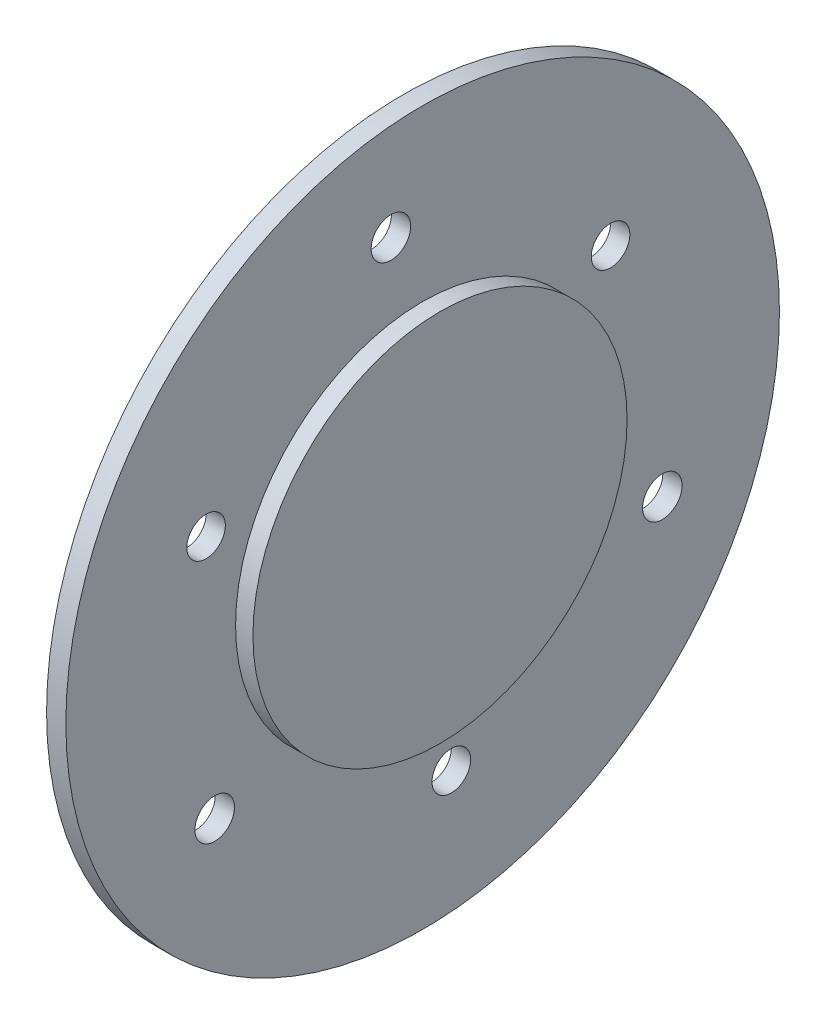
ISO-10303-21;
HEADER;
FILE_DESCRIPTION(('STEP AP214'),'2;1');
FILE_NAME('part.step','',(''),(''),'','','');
FILE_SCHEMA(('AUTOMOTIVE_DESIGN { 1 0 10303 214 1 1 1 1 }'));
ENDSEC;
DATA;
#1=APPLICATION_CONTEXT('core data for automotive mechanical design processes');
#2=APPLICATION_PROTOCOL_DEFINITION('international standard','automotive_design',2000,#1);
#3=PRODUCT_CONTEXT('',#1,'mechanical');
#4=PRODUCT('Part','Part','',(#3));
#5=PRODUCT_RELATED_PRODUCT_CATEGORY('part','',(#4));
#6=PRODUCT_DEFINITION_FORMATION('','',#4);
#7=PRODUCT_DEFINITION_CONTEXT('part definition',#1,'design');
#8=PRODUCT_DEFINITION('design','',#6,#7);
#9=PRODUCT_DEFINITION_SHAPE('','',#8);
#10=(LENGTH_UNIT() NAMED_UNIT(*) SI_UNIT(.MILLI.,.METRE.));
#11=(NAMED_UNIT(*) PLANE_ANGLE_UNIT() SI_UNIT($,.RADIAN.));
#12=(NAMED_UNIT(*) SI_UNIT($,.STERADIAN.) SOLID_ANGLE_UNIT());
#13=UNCERTAINTY_MEASURE_WITH_UNIT(LENGTH_MEASURE(1.E-05),#10,'distance_accuracy_value','');
#14=(GEOMETRIC_REPRESENTATION_CONTEXT(3) GLOBAL_UNCERTAINTY_ASSIGNED_CONTEXT((#13)) GLOBAL_UNIT_ASSIGNED_CONTEXT((#10,
#11,#12)) REPRESENTATION_CONTEXT('',''));
#15=CARTESIAN_POINT('',(0.,0.,0.));
#16=DIRECTION('',(0.,0.,1.));
#17=DIRECTION('',(1.,0.,0.));
#18=AXIS2_PLACEMENT_3D('',#15,#16,#17);
#19=CARTESIAN_POINT('',(6.4,0.,0.));
#20=DIRECTION('',(1.,0.,0.));
#21=DIRECTION('',(0.,0.,1.));
#22=AXIS2_PLACEMENT_3D('',#19,#20,#21);
#23=PLANE('',#22);
#24=CARTESIAN_POINT('',(6.4,0.,0.));
#25=DIRECTION('',(-1.,0.,0.));
#26=DIRECTION('',(0.,0.,-1.));
#27=AXIS2_PLACEMENT_3D('',#24,#25,#26);
#28=CIRCLE('',#27,9.7);
#29=CARTESIAN_POINT('',(6.4,0.,-9.7));
#30=VERTEX_POINT('',#29);
#31=EDGE_CURVE('E39',#30,#30,#28,.T.);
#32=ORIENTED_EDGE('',*,*,#31,.F.);
#33=EDGE_LOOP('',(#32));
#34=FACE_BOUND('',#33,.T.);
#35=ADVANCED_FACE('F14',(#34),#23,.T.);
#36=CARTESIAN_POINT('',(4.4,-12.10906305002,-1.486805989543));
#37=DIRECTION('',(1.,0.,0.));
#38=DIRECTION('',(0.,0.,-1.));
#39=AXIS2_PLACEMENT_3D('',#36,#37,#38);
#40=CYLINDRICAL_SURFACE('',#39,1.);
#41=CARTESIAN_POINT('',(5.5,-12.10906305002,-1.486805989543));
#42=DIRECTION('',(-1.,0.,0.));
#43=DIRECTION('',(0.,0.,-1.));
#44=AXIS2_PLACEMENT_3D('',#41,#42,#43);
#45=CIRCLE('',#44,1.);
#46=CARTESIAN_POINT('',(5.5,-12.10906305002,-2.486805989543));
#47=VERTEX_POINT('',#46);
#48=EDGE_CURVE('E138',#47,#47,#45,.T.);
#49=ORIENTED_EDGE('',*,*,#48,.F.);
#50=DIRECTION('',(1.,0.,0.));
#51=VECTOR('',#50,1.);
#52=CARTESIAN_POINT('',(4.4,-12.10906305002,-2.486805989543));
#53=LINE('',#52,#51);
#54=CARTESIAN_POINT('',(4.5,-12.10906305002,-2.486805989543));
#55=VERTEX_POINT('',#54);
#56=EDGE_CURVE('E9',#55,#47,#53,.T.);
#57=ORIENTED_EDGE('',*,*,#56,.F.);
#58=CARTESIAN_POINT('',(4.5,-12.10906305002,-1.486805989543));
#59=DIRECTION('',(-1.,0.,0.));
#60=DIRECTION('',(0.,0.,-1.));
#61=AXIS2_PLACEMENT_3D('',#58,#59,#60);
#62=CIRCLE('',#61,1.);
#63=EDGE_CURVE('E115',#55,#55,#62,.T.);
#64=ORIENTED_EDGE('',*,*,#63,.T.);
#65=ORIENTED_EDGE('',*,*,#56,.T.);
#66=EDGE_LOOP('',(#49,#57,#64,#65));
#67=FACE_BOUND('',#66,.T.);
#68=ADVANCED_FACE('F16',(#67),#40,.F.);
#69=CARTESIAN_POINT('',(4.4,-5.274870234605,-12.4268155216));
#70=DIRECTION('',(1.,0.,0.));
#71=DIRECTION('',(0.,0.,-1.));
#72=AXIS2_PLACEMENT_3D('',#69,#70,#71);
#73=CYLINDRICAL_SURFACE('',#72,1.025);
#74=CARTESIAN_POINT('',(5.5,-5.274870234605,-12.4268155216));
#75=DIRECTION('',(-1.,0.,0.));
#76=DIRECTION('',(0.,0.,-1.));
#77=AXIS2_PLACEMENT_3D('',#74,#75,#76);
#78=CIRCLE('',#77,1.025);
#79=CARTESIAN_POINT('',(5.5,-5.274870234605,-13.4518155216));
#80=VERTEX_POINT('',#79);
#81=EDGE_CURVE('E132',#80,#80,#78,.T.);
#82=ORIENTED_EDGE('',*,*,#81,.F.);
#83=DIRECTION('',(1.,0.,0.));
#84=VECTOR('',#83,1.);
#85=CARTESIAN_POINT('',(4.4,-5.274870234605,-13.4518155216));
#86=LINE('',#85,#84);
#87=CARTESIAN_POINT('',(4.5,-5.274870234605,-13.4518155216));
#88=VERTEX_POINT('',#87);
#89=EDGE_CURVE('E25',#88,#80,#86,.T.);
#90=ORIENTED_EDGE('',*,*,#89,.F.);
#91=CARTESIAN_POINT('',(4.5,-5.274870234605,-12.4268155216));
#92=DIRECTION('',(-1.,0.,0.));
#93=DIRECTION('',(0.,0.,-1.));
#94=AXIS2_PLACEMENT_3D('',#91,#92,#93);
#95=CIRCLE('',#94,1.025);
#96=EDGE_CURVE('E143',#88,#88,#95,.T.);
#97=ORIENTED_EDGE('',*,*,#96,.T.);
#98=ORIENTED_EDGE('',*,*,#89,.T.);
#99=EDGE_LOOP('',(#82,#90,#97,#98));
#100=FACE_BOUND('',#99,.T.);
#101=ADVANCED_FACE('F193',(#100),#73,.F.);
#102=CARTESIAN_POINT('',(4.4,-8.124502812553,10.781579385638));
#103=DIRECTION('',(1.,0.,0.));
#104=DIRECTION('',(0.,0.,-1.));
#105=AXIS2_PLACEMENT_3D('',#102,#103,#104);
#106=CYLINDRICAL_SURFACE('',#105,1.025);
#107=CARTESIAN_POINT('',(5.5,-8.124502812553,10.781579385638));
#108=DIRECTION('',(-1.,0.,0.));
#109=DIRECTION('',(0.,0.,-1.));
#110=AXIS2_PLACEMENT_3D('',#107,#108,#109);
#111=CIRCLE('',#110,1.025);
#112=CARTESIAN_POINT('',(5.5,-8.124502812553,9.756579385638));
#113=VERTEX_POINT('',#112);
#114=EDGE_CURVE('E128',#113,#113,#111,.T.);
#115=ORIENTED_EDGE('',*,*,#114,.F.);
#116=DIRECTION('',(1.,0.,0.));
#117=VECTOR('',#116,1.);
#118=CARTESIAN_POINT('',(4.4,-8.124502812553,9.756579385638));
#119=LINE('',#118,#117);
#120=CARTESIAN_POINT('',(4.5,-8.124502812553,9.756579385638));
#121=VERTEX_POINT('',#120);
#122=EDGE_CURVE('E126',#121,#113,#119,.T.);
#123=ORIENTED_EDGE('',*,*,#122,.F.);
#124=CARTESIAN_POINT('',(4.5,-8.124502812553,10.781579385638));
#125=DIRECTION('',(-1.,0.,0.));
#126=DIRECTION('',(0.,0.,-1.));
#127=AXIS2_PLACEMENT_3D('',#124,#125,#126);
#128=CIRCLE('',#127,1.025);
#129=EDGE_CURVE('E119',#121,#121,#128,.T.);
#130=ORIENTED_EDGE('',*,*,#129,.T.);
#131=ORIENTED_EDGE('',*,*,#122,.T.);
#132=EDGE_LOOP('',(#115,#123,#130,#131));
#133=FACE_BOUND('',#132,.T.);
#134=ADVANCED_FACE('F185',(#133),#106,.F.);
#135=CARTESIAN_POINT('',(5.45,0.,0.));
#136=DIRECTION('',(1.,0.,0.));
#137=DIRECTION('',(0.,0.,-1.));
#138=AXIS2_PLACEMENT_3D('',#135,#136,#137);
#139=CYLINDRICAL_SURFACE('',#138,9.7);
#140=CARTESIAN_POINT('',(5.5,0.,0.));
#141=DIRECTION('',(-1.,0.,0.));
#142=DIRECTION('',(0.,0.,-1.));
#143=AXIS2_PLACEMENT_3D('',#140,#141,#142);
#144=CIRCLE('',#143,9.7);
#145=CARTESIAN_POINT('',(5.5,0.,-9.7));
#146=VERTEX_POINT('',#145);
#147=EDGE_CURVE('E133',#146,#146,#144,.T.);
#148=ORIENTED_EDGE('',*,*,#147,.F.);
#149=DIRECTION('',(1.,0.,0.));
#150=VECTOR('',#149,1.);
#151=CARTESIAN_POINT('',(5.45,0.,-9.7));
#152=LINE('',#151,#150);
#153=EDGE_CURVE('E112',#146,#30,#152,.T.);
#154=ORIENTED_EDGE('',*,*,#153,.T.);
#155=ORIENTED_EDGE('',*,*,#31,.T.);
#156=ORIENTED_EDGE('',*,*,#153,.F.);
#157=EDGE_LOOP('',(#148,#154,#155,#156));
#158=FACE_BOUND('',#157,.T.);
#159=ADVANCED_FACE('F182',(#158),#139,.T.);
#160=CARTESIAN_POINT('',(4.4,7.342143282455,-9.743353222577));
#161=DIRECTION('',(1.,0.,0.));
#162=DIRECTION('',(0.,0.,-1.));
#163=AXIS2_PLACEMENT_3D('',#160,#161,#162);
#164=CYLINDRICAL_SURFACE('',#163,1.);
#165=CARTESIAN_POINT('',(5.5,7.342143282455,-9.743353222577));
#166=DIRECTION('',(-1.,0.,0.));
#167=DIRECTION('',(0.,0.,-1.));
#168=AXIS2_PLACEMENT_3D('',#165,#166,#167);
#169=CIRCLE('',#168,1.);
#170=CARTESIAN_POINT('',(5.5,7.342143282455,-10.74335322257));
#171=VERTEX_POINT('',#170);
#172=EDGE_CURVE('E139',#171,#171,#169,.T.);
#173=ORIENTED_EDGE('',*,*,#172,.F.);
#174=DIRECTION('',(1.,0.,0.));
#175=VECTOR('',#174,1.);
#176=CARTESIAN_POINT('',(4.4,7.342143282455,-10.74335322257));
#177=LINE('',#176,#175);
#178=CARTESIAN_POINT('',(4.5,7.342143282455,-10.74335322257));
#179=VERTEX_POINT('',#178);
#180=EDGE_CURVE('E91',#179,#171,#177,.T.);
#181=ORIENTED_EDGE('',*,*,#180,.F.);
#182=CARTESIAN_POINT('',(4.5,7.342143282455,-9.743353222577));
#183=DIRECTION('',(-1.,0.,0.));
#184=DIRECTION('',(0.,0.,-1.));
#185=AXIS2_PLACEMENT_3D('',#182,#183,#184);
#186=CIRCLE('',#185,1.);
#187=EDGE_CURVE('E152',#179,#179,#186,.T.);
#188=ORIENTED_EDGE('',*,*,#187,.T.);
#189=ORIENTED_EDGE('',*,*,#180,.T.);
#190=EDGE_LOOP('',(#173,#181,#188,#189));
#191=FACE_BOUND('',#190,.T.);
#192=ADVANCED_FACE('F184',(#191),#164,.F.);
#193=CARTESIAN_POINT('',(4.4,4.766919767569,11.23015921212));
#194=DIRECTION('',(1.,0.,0.));
#195=DIRECTION('',(0.,0.,-1.));
#196=AXIS2_PLACEMENT_3D('',#193,#194,#195);
#197=CYLINDRICAL_SURFACE('',#196,1.);
#198=CARTESIAN_POINT('',(5.5,4.766919767569,11.23015921212));
#199=DIRECTION('',(-1.,0.,0.));
#200=DIRECTION('',(0.,0.,-1.));
#201=AXIS2_PLACEMENT_3D('',#198,#199,#200);
#202=CIRCLE('',#201,1.);
#203=CARTESIAN_POINT('',(5.5,4.766919767569,10.23015921212));
#204=VERTEX_POINT('',#203);
#205=EDGE_CURVE('E104',#204,#204,#202,.T.);
#206=ORIENTED_EDGE('',*,*,#205,.F.);
#207=DIRECTION('',(1.,0.,0.));
#208=VECTOR('',#207,1.);
#209=CARTESIAN_POINT('',(4.4,4.766919767569,10.23015921212));
#210=LINE('',#209,#208);
#211=CARTESIAN_POINT('',(4.5,4.766919767569,10.23015921212));
#212=VERTEX_POINT('',#211);
#213=EDGE_CURVE('E99',#212,#204,#210,.T.);
#214=ORIENTED_EDGE('',*,*,#213,.F.);
#215=CARTESIAN_POINT('',(4.5,4.766919767569,11.23015921212));
#216=DIRECTION('',(-1.,0.,0.));
#217=DIRECTION('',(0.,0.,-1.));
#218=AXIS2_PLACEMENT_3D('',#215,#216,#217);
#219=CIRCLE('',#218,1.);
#220=EDGE_CURVE('E102',#212,#212,#219,.T.);
#221=ORIENTED_EDGE('',*,*,#220,.T.);
#222=ORIENTED_EDGE('',*,*,#213,.T.);
#223=EDGE_LOOP('',(#206,#214,#221,#222));
#224=FACE_BOUND('',#223,.T.);
#225=ADVANCED_FACE('F100',(#224),#197,.F.);
#226=CARTESIAN_POINT('',(4.4,13.399373047158,1.645236135969));
#227=DIRECTION('',(1.,0.,0.));
#228=DIRECTION('',(0.,0.,-1.));
#229=AXIS2_PLACEMENT_3D('',#226,#227,#228);
#230=CYLINDRICAL_SURFACE('',#229,1.025);
#231=CARTESIAN_POINT('',(5.5,13.399373047158,1.645236135969));
#232=DIRECTION('',(-1.,0.,0.));
#233=DIRECTION('',(0.,0.,-1.));
#234=AXIS2_PLACEMENT_3D('',#231,#232,#233);
#235=CIRCLE('',#234,1.025);
#236=CARTESIAN_POINT('',(5.5,13.399373047158,0.620236135969));
#237=VERTEX_POINT('',#236);
#238=EDGE_CURVE('E174',#237,#237,#235,.T.);
#239=ORIENTED_EDGE('',*,*,#238,.F.);
#240=DIRECTION('',(1.,0.,0.));
#241=VECTOR('',#240,1.);
#242=CARTESIAN_POINT('',(4.4,13.399373047158,0.620236135969));
#243=LINE('',#242,#241);
#244=CARTESIAN_POINT('',(4.5,13.399373047158,0.620236135969));
#245=VERTEX_POINT('',#244);
#246=EDGE_CURVE('E106',#245,#237,#243,.T.);
#247=ORIENTED_EDGE('',*,*,#246,.F.);
#248=CARTESIAN_POINT('',(4.5,13.399373047158,1.645236135969));
#249=DIRECTION('',(-1.,0.,0.));
#250=DIRECTION('',(0.,0.,-1.));
#251=AXIS2_PLACEMENT_3D('',#248,#249,#250);
#252=CIRCLE('',#251,1.025);
#253=EDGE_CURVE('E134',#245,#245,#252,.T.);
#254=ORIENTED_EDGE('',*,*,#253,.T.);
#255=ORIENTED_EDGE('',*,*,#246,.T.);
#256=EDGE_LOOP('',(#239,#247,#254,#255));
#257=FACE_BOUND('',#256,.T.);
#258=ADVANCED_FACE('F213',(#257),#230,.F.);
#259=CARTESIAN_POINT('',(4.5,0.,0.));
#260=DIRECTION('',(1.,0.,0.));
#261=DIRECTION('',(0.,0.,1.));
#262=AXIS2_PLACEMENT_3D('',#259,#260,#261);
#263=PLANE('',#262);
#264=ORIENTED_EDGE('',*,*,#63,.F.);
#265=EDGE_LOOP('',(#264));
#266=FACE_BOUND('',#265,.T.);
#267=ORIENTED_EDGE('',*,*,#96,.F.);
#268=EDGE_LOOP('',(#267));
#269=FACE_BOUND('',#268,.T.);
#270=ORIENTED_EDGE('',*,*,#129,.F.);
#271=EDGE_LOOP('',(#270));
#272=FACE_BOUND('',#271,.T.);
#273=ORIENTED_EDGE('',*,*,#187,.F.);
#274=EDGE_LOOP('',(#273));
#275=FACE_BOUND('',#274,.T.);
#276=ORIENTED_EDGE('',*,*,#220,.F.);
#277=EDGE_LOOP('',(#276));
#278=FACE_BOUND('',#277,.T.);
#279=ORIENTED_EDGE('',*,*,#253,.F.);
#280=EDGE_LOOP('',(#279));
#281=FACE_BOUND('',#280,.T.);
#282=CARTESIAN_POINT('',(4.5,0.,0.));
#283=DIRECTION('',(-1.,0.,0.));
#284=DIRECTION('',(0.,0.,-1.));
#285=AXIS2_PLACEMENT_3D('',#282,#283,#284);
#286=CIRCLE('',#285,18.5);
#287=CARTESIAN_POINT('',(4.5,0.,-18.5));
#288=VERTEX_POINT('',#287);
#289=EDGE_CURVE('E124',#288,#288,#286,.T.);
#290=ORIENTED_EDGE('',*,*,#289,.T.);
#291=EDGE_LOOP('',(#290));
#292=FACE_BOUND('',#291,.T.);
#293=ADVANCED_FACE('F210',(#266,#269,#272,#275,#278,#281,#292),#263,.F.);
#294=CARTESIAN_POINT('',(5.5,0.,0.));
#295=DIRECTION('',(1.,0.,0.));
#296=DIRECTION('',(0.,0.,1.));
#297=AXIS2_PLACEMENT_3D('',#294,#295,#296);
#298=PLANE('',#297);
#299=ORIENTED_EDGE('',*,*,#48,.T.);
#300=EDGE_LOOP('',(#299));
#301=FACE_BOUND('',#300,.T.);
#302=ORIENTED_EDGE('',*,*,#81,.T.);
#303=EDGE_LOOP('',(#302));
#304=FACE_BOUND('',#303,.T.);
#305=ORIENTED_EDGE('',*,*,#114,.T.);
#306=EDGE_LOOP('',(#305));
#307=FACE_BOUND('',#306,.T.);
#308=ORIENTED_EDGE('',*,*,#147,.T.);
#309=EDGE_LOOP('',(#308));
#310=FACE_BOUND('',#309,.T.);
#311=ORIENTED_EDGE('',*,*,#172,.T.);
#312=EDGE_LOOP('',(#311));
#313=FACE_BOUND('',#312,.T.);
#314=ORIENTED_EDGE('',*,*,#205,.T.);
#315=EDGE_LOOP('',(#314));
#316=FACE_BOUND('',#315,.T.);
#317=ORIENTED_EDGE('',*,*,#238,.T.);
#318=EDGE_LOOP('',(#317));
#319=FACE_BOUND('',#318,.T.);
#320=CARTESIAN_POINT('',(5.5,0.,0.));
#321=DIRECTION('',(-1.,0.,0.));
#322=DIRECTION('',(0.,0.,-1.));
#323=AXIS2_PLACEMENT_3D('',#320,#321,#322);
#324=CIRCLE('',#323,18.5);
#325=CARTESIAN_POINT('',(5.5,0.,-18.5));
#326=VERTEX_POINT('',#325);
#327=EDGE_CURVE('E18',#326,#326,#324,.T.);
#328=ORIENTED_EDGE('',*,*,#327,.F.);
#329=EDGE_LOOP('',(#328));
#330=FACE_BOUND('',#329,.T.);
#331=ADVANCED_FACE('F180',(#301,#304,#307,#310,#313,#316,#319,#330),#298,.T.);
#332=CARTESIAN_POINT('',(4.5,0.,0.));
#333=DIRECTION('',(1.,0.,0.));
#334=DIRECTION('',(0.,0.,-1.));
#335=AXIS2_PLACEMENT_3D('',#332,#333,#334);
#336=CYLINDRICAL_SURFACE('',#335,18.5);
#337=DIRECTION('',(1.,0.,0.));
#338=VECTOR('',#337,1.);
#339=CARTESIAN_POINT('',(4.5,0.,-18.5));
#340=LINE('',#339,#338);
#341=EDGE_CURVE('E121',#288,#326,#340,.T.);
#342=ORIENTED_EDGE('',*,*,#341,.F.);
#343=ORIENTED_EDGE('',*,*,#289,.F.);
#344=ORIENTED_EDGE('',*,*,#341,.T.);
#345=ORIENTED_EDGE('',*,*,#327,.T.);
#346=EDGE_LOOP('',(#342,#343,#344,#345));
#347=FACE_BOUND('',#346,.T.);
#348=ADVANCED_FACE('F204',(#347),#336,.T.);
#349=CLOSED_SHELL('',(#35,#68,#101,#134,#159,#192,#225,#258,#293,#331,#348));
#350=MANIFOLD_SOLID_BREP('B1',#349);
#351=ADVANCED_BREP_SHAPE_REPRESENTATION('',(#18,#350),#14);
#352=SHAPE_DEFINITION_REPRESENTATION(#9,#351);
ENDSEC;
END-ISO-10303-21;
